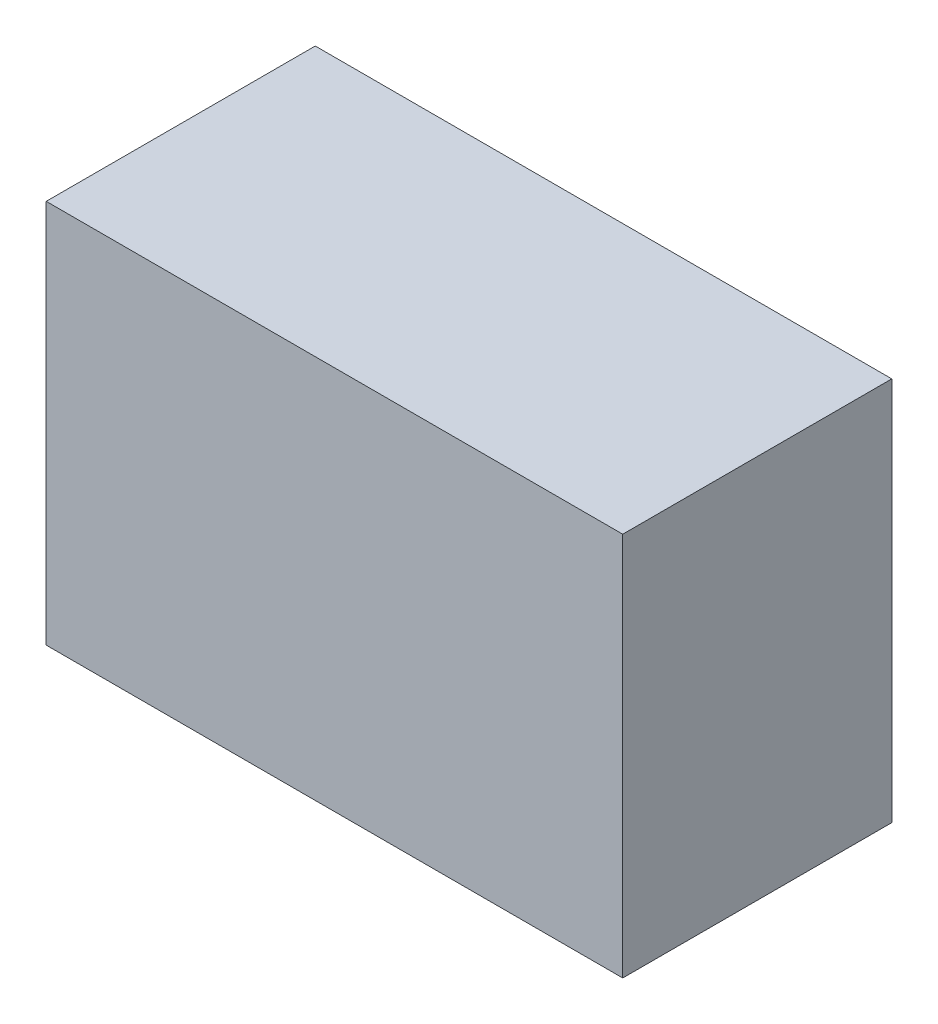
ISO-10303-21;
HEADER;
FILE_DESCRIPTION(('STEP AP214'),'2;1');
FILE_NAME('part.step','',(''),(''),'','','');
FILE_SCHEMA(('AUTOMOTIVE_DESIGN { 1 0 10303 214 1 1 1 1 }'));
ENDSEC;
DATA;
#1=APPLICATION_CONTEXT('core data for automotive mechanical design processes');
#2=APPLICATION_PROTOCOL_DEFINITION('international standard','automotive_design',2000,#1);
#3=PRODUCT_CONTEXT('',#1,'mechanical');
#4=PRODUCT('Part','Part','',(#3));
#5=PRODUCT_RELATED_PRODUCT_CATEGORY('part','',(#4));
#6=PRODUCT_DEFINITION_FORMATION('','',#4);
#7=PRODUCT_DEFINITION_CONTEXT('part definition',#1,'design');
#8=PRODUCT_DEFINITION('design','',#6,#7);
#9=PRODUCT_DEFINITION_SHAPE('','',#8);
#10=(LENGTH_UNIT() NAMED_UNIT(*) SI_UNIT(.MILLI.,.METRE.));
#11=(NAMED_UNIT(*) PLANE_ANGLE_UNIT() SI_UNIT($,.RADIAN.));
#12=(NAMED_UNIT(*) SI_UNIT($,.STERADIAN.) SOLID_ANGLE_UNIT());
#13=UNCERTAINTY_MEASURE_WITH_UNIT(LENGTH_MEASURE(1.E-05),#10,'distance_accuracy_value','');
#14=(GEOMETRIC_REPRESENTATION_CONTEXT(3) GLOBAL_UNCERTAINTY_ASSIGNED_CONTEXT((#13)) GLOBAL_UNIT_ASSIGNED_CONTEXT((#10,
#11,#12)) REPRESENTATION_CONTEXT('',''));
#15=CARTESIAN_POINT('',(0.,0.,0.));
#16=DIRECTION('',(0.,0.,1.));
#17=DIRECTION('',(1.,0.,0.));
#18=AXIS2_PLACEMENT_3D('',#15,#16,#17);
#19=CARTESIAN_POINT('',(0.,0.,0.7));
#20=DIRECTION('',(1.,0.,0.));
#21=DIRECTION('',(0.,0.,-1.));
#22=AXIS2_PLACEMENT_3D('',#19,#20,#21);
#23=PLANE('',#22);
#24=DIRECTION('',(0.,-1.,0.));
#25=VECTOR('',#24,1.);
#26=CARTESIAN_POINT('',(0.,0.,0.));
#27=LINE('',#26,#25);
#28=CARTESIAN_POINT('',(0.,1.,0.));
#29=VERTEX_POINT('',#28);
#30=CARTESIAN_POINT('',(0.,0.,0.));
#31=VERTEX_POINT('',#30);
#32=EDGE_CURVE('E11',#29,#31,#27,.T.);
#33=ORIENTED_EDGE('',*,*,#32,.T.);
#34=DIRECTION('',(0.,0.,-1.));
#35=VECTOR('',#34,1.);
#36=CARTESIAN_POINT('',(0.,0.,0.7));
#37=LINE('',#36,#35);
#38=CARTESIAN_POINT('',(0.,0.,0.7));
#39=VERTEX_POINT('',#38);
#40=EDGE_CURVE('E24',#39,#31,#37,.T.);
#41=ORIENTED_EDGE('',*,*,#40,.F.);
#42=DIRECTION('',(0.,-1.,0.));
#43=VECTOR('',#42,1.);
#44=CARTESIAN_POINT('',(0.,0.,0.7));
#45=LINE('',#44,#43);
#46=CARTESIAN_POINT('',(0.,1.,0.7));
#47=VERTEX_POINT('',#46);
#48=EDGE_CURVE('E88',#47,#39,#45,.T.);
#49=ORIENTED_EDGE('',*,*,#48,.F.);
#50=DIRECTION('',(0.,0.,-1.));
#51=VECTOR('',#50,1.);
#52=CARTESIAN_POINT('',(0.,1.,0.7));
#53=LINE('',#52,#51);
#54=EDGE_CURVE('E77',#47,#29,#53,.T.);
#55=ORIENTED_EDGE('',*,*,#54,.T.);
#56=EDGE_LOOP('',(#33,#41,#49,#55));
#57=FACE_BOUND('',#56,.T.);
#58=ADVANCED_FACE('F17',(#57),#23,.F.);
#59=CARTESIAN_POINT('',(0.,0.,0.7));
#60=DIRECTION('',(0.,1.,0.));
#61=DIRECTION('',(0.,0.,1.));
#62=AXIS2_PLACEMENT_3D('',#59,#60,#61);
#63=PLANE('',#62);
#64=DIRECTION('',(1.,0.,0.));
#65=VECTOR('',#64,1.);
#66=CARTESIAN_POINT('',(0.,0.,0.));
#67=LINE('',#66,#65);
#68=CARTESIAN_POINT('',(1.5,0.,0.));
#69=VERTEX_POINT('',#68);
#70=EDGE_CURVE('E85',#31,#69,#67,.T.);
#71=ORIENTED_EDGE('',*,*,#70,.T.);
#72=DIRECTION('',(0.,0.,-1.));
#73=VECTOR('',#72,1.);
#74=CARTESIAN_POINT('',(1.5,0.,0.7));
#75=LINE('',#74,#73);
#76=CARTESIAN_POINT('',(1.5,0.,0.7));
#77=VERTEX_POINT('',#76);
#78=EDGE_CURVE('E83',#77,#69,#75,.T.);
#79=ORIENTED_EDGE('',*,*,#78,.F.);
#80=DIRECTION('',(1.,0.,0.));
#81=VECTOR('',#80,1.);
#82=CARTESIAN_POINT('',(0.,0.,0.7));
#83=LINE('',#82,#81);
#84=EDGE_CURVE('E72',#39,#77,#83,.T.);
#85=ORIENTED_EDGE('',*,*,#84,.F.);
#86=ORIENTED_EDGE('',*,*,#40,.T.);
#87=EDGE_LOOP('',(#71,#79,#85,#86));
#88=FACE_BOUND('',#87,.T.);
#89=ADVANCED_FACE('F90',(#88),#63,.F.);
#90=CARTESIAN_POINT('',(1.5,0.,0.7));
#91=DIRECTION('',(-1.,0.,0.));
#92=DIRECTION('',(0.,0.,1.));
#93=AXIS2_PLACEMENT_3D('',#90,#91,#92);
#94=PLANE('',#93);
#95=DIRECTION('',(0.,1.,0.));
#96=VECTOR('',#95,1.);
#97=CARTESIAN_POINT('',(1.5,0.,0.));
#98=LINE('',#97,#96);
#99=CARTESIAN_POINT('',(1.5,1.,0.));
#100=VERTEX_POINT('',#99);
#101=EDGE_CURVE('E60',#69,#100,#98,.T.);
#102=ORIENTED_EDGE('',*,*,#101,.T.);
#103=DIRECTION('',(0.,0.,-1.));
#104=VECTOR('',#103,1.);
#105=CARTESIAN_POINT('',(1.5,1.,0.7));
#106=LINE('',#105,#104);
#107=CARTESIAN_POINT('',(1.5,1.,0.7));
#108=VERTEX_POINT('',#107);
#109=EDGE_CURVE('E54',#108,#100,#106,.T.);
#110=ORIENTED_EDGE('',*,*,#109,.F.);
#111=DIRECTION('',(0.,1.,0.));
#112=VECTOR('',#111,1.);
#113=CARTESIAN_POINT('',(1.5,0.,0.7));
#114=LINE('',#113,#112);
#115=EDGE_CURVE('E58',#77,#108,#114,.T.);
#116=ORIENTED_EDGE('',*,*,#115,.F.);
#117=ORIENTED_EDGE('',*,*,#78,.T.);
#118=EDGE_LOOP('',(#102,#110,#116,#117));
#119=FACE_BOUND('',#118,.T.);
#120=ADVANCED_FACE('F56',(#119),#94,.F.);
#121=CARTESIAN_POINT('',(0.,1.,0.7));
#122=DIRECTION('',(0.,-1.,0.));
#123=DIRECTION('',(0.,0.,-1.));
#124=AXIS2_PLACEMENT_3D('',#121,#122,#123);
#125=PLANE('',#124);
#126=DIRECTION('',(-1.,0.,0.));
#127=VECTOR('',#126,1.);
#128=CARTESIAN_POINT('',(0.,1.,0.));
#129=LINE('',#128,#127);
#130=EDGE_CURVE('E73',#100,#29,#129,.T.);
#131=ORIENTED_EDGE('',*,*,#130,.T.);
#132=ORIENTED_EDGE('',*,*,#54,.F.);
#133=DIRECTION('',(-1.,0.,0.));
#134=VECTOR('',#133,1.);
#135=CARTESIAN_POINT('',(0.,1.,0.7));
#136=LINE('',#135,#134);
#137=EDGE_CURVE('E70',#108,#47,#136,.T.);
#138=ORIENTED_EDGE('',*,*,#137,.F.);
#139=ORIENTED_EDGE('',*,*,#109,.T.);
#140=EDGE_LOOP('',(#131,#132,#138,#139));
#141=FACE_BOUND('',#140,.T.);
#142=ADVANCED_FACE('F76',(#141),#125,.F.);
#143=CARTESIAN_POINT('',(0.,1.,0.7));
#144=DIRECTION('',(0.,0.,-1.));
#145=DIRECTION('',(-1.,0.,0.));
#146=AXIS2_PLACEMENT_3D('',#143,#144,#145);
#147=PLANE('',#146);
#148=ORIENTED_EDGE('',*,*,#48,.T.);
#149=ORIENTED_EDGE('',*,*,#84,.T.);
#150=ORIENTED_EDGE('',*,*,#115,.T.);
#151=ORIENTED_EDGE('',*,*,#137,.T.);
#152=EDGE_LOOP('',(#148,#149,#150,#151));
#153=FACE_BOUND('',#152,.T.);
#154=ADVANCED_FACE('F69',(#153),#147,.F.);
#155=CARTESIAN_POINT('',(0.,1.,0.));
#156=DIRECTION('',(0.,0.,-1.));
#157=DIRECTION('',(-1.,0.,0.));
#158=AXIS2_PLACEMENT_3D('',#155,#156,#157);
#159=PLANE('',#158);
#160=ORIENTED_EDGE('',*,*,#32,.F.);
#161=ORIENTED_EDGE('',*,*,#130,.F.);
#162=ORIENTED_EDGE('',*,*,#101,.F.);
#163=ORIENTED_EDGE('',*,*,#70,.F.);
#164=EDGE_LOOP('',(#160,#161,#162,#163));
#165=FACE_BOUND('',#164,.T.);
#166=ADVANCED_FACE('F91',(#165),#159,.T.);
#167=CLOSED_SHELL('',(#58,#89,#120,#142,#154,#166));
#168=MANIFOLD_SOLID_BREP('B1',#167);
#169=ADVANCED_BREP_SHAPE_REPRESENTATION('',(#18,#168),#14);
#170=SHAPE_DEFINITION_REPRESENTATION(#9,#169);
ENDSEC;
END-ISO-10303-21;
